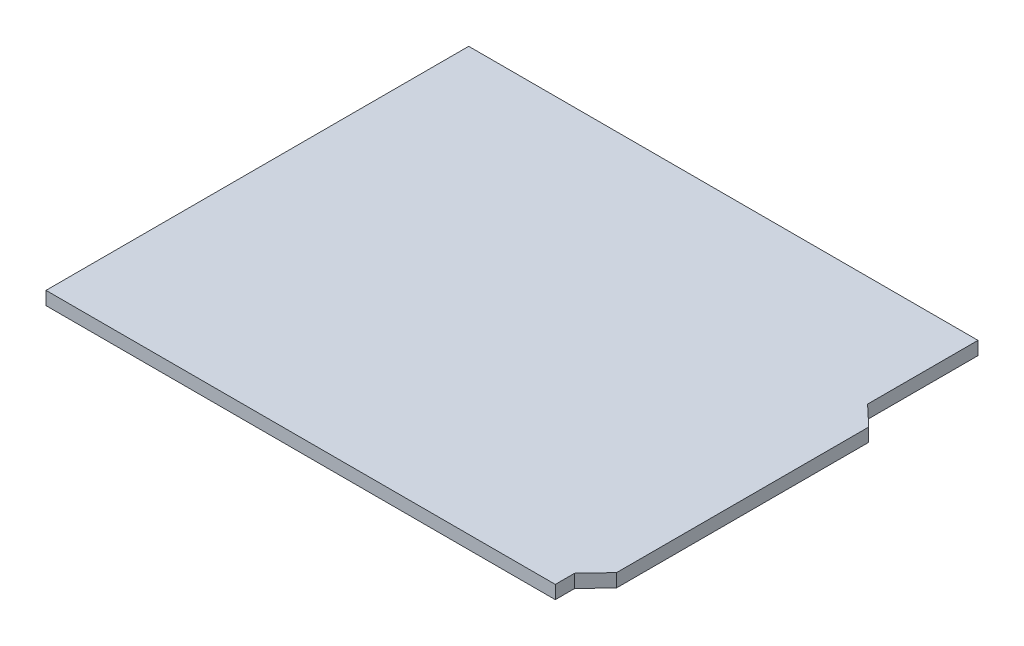
ISO-10303-21;
HEADER;
FILE_DESCRIPTION(('STEP AP214'),'2;1');
FILE_NAME('part.step','',(''),(''),'','','');
FILE_SCHEMA(('AUTOMOTIVE_DESIGN { 1 0 10303 214 1 1 1 1 }'));
ENDSEC;
DATA;
#1=APPLICATION_CONTEXT('core data for automotive mechanical design processes');
#2=APPLICATION_PROTOCOL_DEFINITION('international standard','automotive_design',2000,#1);
#3=PRODUCT_CONTEXT('',#1,'mechanical');
#4=PRODUCT('Part','Part','',(#3));
#5=PRODUCT_RELATED_PRODUCT_CATEGORY('part','',(#4));
#6=PRODUCT_DEFINITION_FORMATION('','',#4);
#7=PRODUCT_DEFINITION_CONTEXT('part definition',#1,'design');
#8=PRODUCT_DEFINITION('design','',#6,#7);
#9=PRODUCT_DEFINITION_SHAPE('','',#8);
#10=(LENGTH_UNIT() NAMED_UNIT(*) SI_UNIT(.MILLI.,.METRE.));
#11=(NAMED_UNIT(*) PLANE_ANGLE_UNIT() SI_UNIT($,.RADIAN.));
#12=(NAMED_UNIT(*) SI_UNIT($,.STERADIAN.) SOLID_ANGLE_UNIT());
#13=UNCERTAINTY_MEASURE_WITH_UNIT(LENGTH_MEASURE(1.E-05),#10,'distance_accuracy_value','');
#14=(GEOMETRIC_REPRESENTATION_CONTEXT(3) GLOBAL_UNCERTAINTY_ASSIGNED_CONTEXT((#13)) GLOBAL_UNIT_ASSIGNED_CONTEXT((#10,
#11,#12)) REPRESENTATION_CONTEXT('',''));
#15=CARTESIAN_POINT('',(0.,0.,0.));
#16=DIRECTION('',(0.,0.,1.));
#17=DIRECTION('',(1.,0.,0.));
#18=AXIS2_PLACEMENT_3D('',#15,#16,#17);
#19=CARTESIAN_POINT('',(0.,1.72,27.41));
#20=DIRECTION('',(0.,0.,-1.));
#21=DIRECTION('',(-1.,0.,0.));
#22=AXIS2_PLACEMENT_3D('',#19,#20,#21);
#23=PLANE('',#22);
#24=DIRECTION('',(1.,0.,0.));
#25=VECTOR('',#24,1.);
#26=CARTESIAN_POINT('',(0.,0.,27.41));
#27=LINE('',#26,#25);
#28=CARTESIAN_POINT('',(-33.025,0.,27.41));
#29=VERTEX_POINT('',#28);
#30=CARTESIAN_POINT('',(33.025,0.,27.41));
#31=VERTEX_POINT('',#30);
#32=EDGE_CURVE('E135',#29,#31,#27,.T.);
#33=ORIENTED_EDGE('',*,*,#32,.T.);
#34=DIRECTION('',(0.,-1.,0.));
#35=VECTOR('',#34,1.);
#36=CARTESIAN_POINT('',(33.025,1.72,27.41));
#37=LINE('',#36,#35);
#38=CARTESIAN_POINT('',(33.025,1.72,27.41));
#39=VERTEX_POINT('',#38);
#40=EDGE_CURVE('E11',#39,#31,#37,.T.);
#41=ORIENTED_EDGE('',*,*,#40,.F.);
#42=DIRECTION('',(1.,0.,0.));
#43=VECTOR('',#42,1.);
#44=CARTESIAN_POINT('',(0.,1.72,27.41));
#45=LINE('',#44,#43);
#46=CARTESIAN_POINT('',(-33.025,1.72,27.41));
#47=VERTEX_POINT('',#46);
#48=EDGE_CURVE('E154',#47,#39,#45,.T.);
#49=ORIENTED_EDGE('',*,*,#48,.F.);
#50=DIRECTION('',(0.,-1.,0.));
#51=VECTOR('',#50,1.);
#52=CARTESIAN_POINT('',(-33.025,1.72,27.41));
#53=LINE('',#52,#51);
#54=EDGE_CURVE('E53',#47,#29,#53,.T.);
#55=ORIENTED_EDGE('',*,*,#54,.T.);
#56=EDGE_LOOP('',(#33,#41,#49,#55));
#57=FACE_BOUND('',#56,.T.);
#58=ADVANCED_FACE('F37',(#57),#23,.F.);
#59=CARTESIAN_POINT('',(33.025,1.72,0.));
#60=DIRECTION('',(-1.,0.,0.));
#61=DIRECTION('',(0.,0.,1.));
#62=AXIS2_PLACEMENT_3D('',#59,#60,#61);
#63=PLANE('',#62);
#64=DIRECTION('',(0.,0.,-1.));
#65=VECTOR('',#64,1.);
#66=CARTESIAN_POINT('',(33.025,0.,0.));
#67=LINE('',#66,#65);
#68=CARTESIAN_POINT('',(33.025,0.,24.91));
#69=VERTEX_POINT('',#68);
#70=EDGE_CURVE('E137',#31,#69,#67,.T.);
#71=ORIENTED_EDGE('',*,*,#70,.T.);
#72=DIRECTION('',(0.,-1.,0.));
#73=VECTOR('',#72,1.);
#74=CARTESIAN_POINT('',(33.025,1.72,24.91));
#75=LINE('',#74,#73);
#76=CARTESIAN_POINT('',(33.025,1.72,24.91));
#77=VERTEX_POINT('',#76);
#78=EDGE_CURVE('E45',#77,#69,#75,.T.);
#79=ORIENTED_EDGE('',*,*,#78,.F.);
#80=DIRECTION('',(0.,0.,-1.));
#81=VECTOR('',#80,1.);
#82=CARTESIAN_POINT('',(33.025,1.72,0.));
#83=LINE('',#82,#81);
#84=EDGE_CURVE('E91',#39,#77,#83,.T.);
#85=ORIENTED_EDGE('',*,*,#84,.F.);
#86=ORIENTED_EDGE('',*,*,#40,.T.);
#87=EDGE_LOOP('',(#71,#79,#85,#86));
#88=FACE_BOUND('',#87,.T.);
#89=ADVANCED_FACE('F167',(#88),#63,.F.);
#90=CARTESIAN_POINT('',(29.8569015979815,1.72,28.2574247266611));
#91=DIRECTION('',(0.726293399809768,0.,0.687384824819961));
#92=DIRECTION('',(0.687384824819961,0.,-0.726293399809768));
#93=AXIS2_PLACEMENT_3D('',#90,#91,#92);
#94=PLANE('',#93);
#95=DIRECTION('',(-0.687384824819961,0.,0.726293399809768));
#96=VECTOR('',#95,1.);
#97=CARTESIAN_POINT('',(29.8569015979815,0.,28.2574247266611));
#98=LINE('',#97,#96);
#99=CARTESIAN_POINT('',(35.675,0.,22.11));
#100=VERTEX_POINT('',#99);
#101=EDGE_CURVE('E140',#100,#69,#98,.T.);
#102=ORIENTED_EDGE('',*,*,#101,.F.);
#103=DIRECTION('',(0.,-1.,0.));
#104=VECTOR('',#103,1.);
#105=CARTESIAN_POINT('',(35.675,1.72,22.11));
#106=LINE('',#105,#104);
#107=CARTESIAN_POINT('',(35.675,1.72,22.11));
#108=VERTEX_POINT('',#107);
#109=EDGE_CURVE('E160',#108,#100,#106,.T.);
#110=ORIENTED_EDGE('',*,*,#109,.F.);
#111=DIRECTION('',(-0.687384824819961,0.,0.726293399809768));
#112=VECTOR('',#111,1.);
#113=CARTESIAN_POINT('',(29.8569015979815,1.72,28.2574247266611));
#114=LINE('',#113,#112);
#115=EDGE_CURVE('E166',#108,#77,#114,.T.);
#116=ORIENTED_EDGE('',*,*,#115,.T.);
#117=ORIENTED_EDGE('',*,*,#78,.T.);
#118=EDGE_LOOP('',(#102,#110,#116,#117));
#119=FACE_BOUND('',#118,.T.);
#120=ADVANCED_FACE('F164',(#119),#94,.T.);
#121=CARTESIAN_POINT('',(35.675,1.72,0.));
#122=DIRECTION('',(1.,0.,0.));
#123=DIRECTION('',(0.,0.,-1.));
#124=AXIS2_PLACEMENT_3D('',#121,#122,#123);
#125=PLANE('',#124);
#126=DIRECTION('',(0.,0.,1.));
#127=VECTOR('',#126,1.);
#128=CARTESIAN_POINT('',(35.675,0.,0.));
#129=LINE('',#128,#127);
#130=CARTESIAN_POINT('',(35.675,0.,-10.59));
#131=VERTEX_POINT('',#130);
#132=EDGE_CURVE('E143',#131,#100,#129,.T.);
#133=ORIENTED_EDGE('',*,*,#132,.F.);
#134=DIRECTION('',(0.,-1.,0.));
#135=VECTOR('',#134,1.);
#136=CARTESIAN_POINT('',(35.675,1.72,-10.59));
#137=LINE('',#136,#135);
#138=CARTESIAN_POINT('',(35.675,1.72,-10.59));
#139=VERTEX_POINT('',#138);
#140=EDGE_CURVE('E158',#139,#131,#137,.T.);
#141=ORIENTED_EDGE('',*,*,#140,.F.);
#142=DIRECTION('',(0.,0.,1.));
#143=VECTOR('',#142,1.);
#144=CARTESIAN_POINT('',(35.675,1.72,0.));
#145=LINE('',#144,#143);
#146=EDGE_CURVE('E176',#139,#108,#145,.T.);
#147=ORIENTED_EDGE('',*,*,#146,.T.);
#148=ORIENTED_EDGE('',*,*,#109,.T.);
#149=EDGE_LOOP('',(#133,#141,#147,#148));
#150=FACE_BOUND('',#149,.T.);
#151=ADVANCED_FACE('F174',(#150),#125,.T.);
#152=CARTESIAN_POINT('',(22.0853268035411,1.72,-23.4104464117536));
#153=DIRECTION('',(0.686220426895719,0.,-0.727393652509463));
#154=DIRECTION('',(-0.727393652509463,0.,-0.686220426895719));
#155=AXIS2_PLACEMENT_3D('',#152,#153,#154);
#156=PLANE('',#155);
#157=DIRECTION('',(0.727393652509463,0.,0.686220426895719));
#158=VECTOR('',#157,1.);
#159=CARTESIAN_POINT('',(22.0853268035411,0.,-23.4104464117536));
#160=LINE('',#159,#158);
#161=CARTESIAN_POINT('',(33.025,0.,-13.09));
#162=VERTEX_POINT('',#161);
#163=EDGE_CURVE('E146',#162,#131,#160,.T.);
#164=ORIENTED_EDGE('',*,*,#163,.F.);
#165=DIRECTION('',(0.,-1.,0.));
#166=VECTOR('',#165,1.);
#167=CARTESIAN_POINT('',(33.025,1.72,-13.09));
#168=LINE('',#167,#166);
#169=CARTESIAN_POINT('',(33.025,1.72,-13.09));
#170=VERTEX_POINT('',#169);
#171=EDGE_CURVE('E126',#170,#162,#168,.T.);
#172=ORIENTED_EDGE('',*,*,#171,.F.);
#173=DIRECTION('',(0.727393652509463,0.,0.686220426895719));
#174=VECTOR('',#173,1.);
#175=CARTESIAN_POINT('',(22.0853268035411,1.72,-23.4104464117536));
#176=LINE('',#175,#174);
#177=EDGE_CURVE('E116',#170,#139,#176,.T.);
#178=ORIENTED_EDGE('',*,*,#177,.T.);
#179=ORIENTED_EDGE('',*,*,#140,.T.);
#180=EDGE_LOOP('',(#164,#172,#178,#179));
#181=FACE_BOUND('',#180,.T.);
#182=ADVANCED_FACE('F199',(#181),#156,.T.);
#183=CARTESIAN_POINT('',(33.025,0.,-27.41));
#184=VERTEX_POINT('',#183);
#185=EDGE_CURVE('E123',#162,#184,#67,.T.);
#186=ORIENTED_EDGE('',*,*,#185,.T.);
#187=DIRECTION('',(0.,-1.,0.));
#188=VECTOR('',#187,1.);
#189=CARTESIAN_POINT('',(33.025,1.72,-27.41));
#190=LINE('',#189,#188);
#191=CARTESIAN_POINT('',(33.025,1.72,-27.41));
#192=VERTEX_POINT('',#191);
#193=EDGE_CURVE('E120',#192,#184,#190,.T.);
#194=ORIENTED_EDGE('',*,*,#193,.F.);
#195=EDGE_CURVE('E108',#170,#192,#83,.T.);
#196=ORIENTED_EDGE('',*,*,#195,.F.);
#197=ORIENTED_EDGE('',*,*,#171,.T.);
#198=EDGE_LOOP('',(#186,#194,#196,#197));
#199=FACE_BOUND('',#198,.T.);
#200=ADVANCED_FACE('F121',(#199),#63,.F.);
#201=CARTESIAN_POINT('',(0.,1.72,-27.41));
#202=DIRECTION('',(0.,0.,-1.));
#203=DIRECTION('',(-1.,0.,0.));
#204=AXIS2_PLACEMENT_3D('',#201,#202,#203);
#205=PLANE('',#204);
#206=DIRECTION('',(1.,0.,0.));
#207=VECTOR('',#206,1.);
#208=CARTESIAN_POINT('',(0.,0.,-27.41));
#209=LINE('',#208,#207);
#210=CARTESIAN_POINT('',(-33.025,0.,-27.41));
#211=VERTEX_POINT('',#210);
#212=EDGE_CURVE('E149',#211,#184,#209,.T.);
#213=ORIENTED_EDGE('',*,*,#212,.F.);
#214=DIRECTION('',(0.,-1.,0.));
#215=VECTOR('',#214,1.);
#216=CARTESIAN_POINT('',(-33.025,1.72,-27.41));
#217=LINE('',#216,#215);
#218=CARTESIAN_POINT('',(-33.025,1.72,-27.41));
#219=VERTEX_POINT('',#218);
#220=EDGE_CURVE('E79',#219,#211,#217,.T.);
#221=ORIENTED_EDGE('',*,*,#220,.F.);
#222=DIRECTION('',(1.,0.,0.));
#223=VECTOR('',#222,1.);
#224=CARTESIAN_POINT('',(0.,1.72,-27.41));
#225=LINE('',#224,#223);
#226=EDGE_CURVE('E113',#219,#192,#225,.T.);
#227=ORIENTED_EDGE('',*,*,#226,.T.);
#228=ORIENTED_EDGE('',*,*,#193,.T.);
#229=EDGE_LOOP('',(#213,#221,#227,#228));
#230=FACE_BOUND('',#229,.T.);
#231=ADVANCED_FACE('F128',(#230),#205,.T.);
#232=CARTESIAN_POINT('',(-33.025,1.72,0.));
#233=DIRECTION('',(-1.,0.,0.));
#234=DIRECTION('',(0.,0.,1.));
#235=AXIS2_PLACEMENT_3D('',#232,#233,#234);
#236=PLANE('',#235);
#237=DIRECTION('',(0.,0.,-1.));
#238=VECTOR('',#237,1.);
#239=CARTESIAN_POINT('',(-33.025,0.,0.));
#240=LINE('',#239,#238);
#241=EDGE_CURVE('E151',#29,#211,#240,.T.);
#242=ORIENTED_EDGE('',*,*,#241,.F.);
#243=ORIENTED_EDGE('',*,*,#54,.F.);
#244=DIRECTION('',(0.,0.,-1.));
#245=VECTOR('',#244,1.);
#246=CARTESIAN_POINT('',(-33.025,1.72,0.));
#247=LINE('',#246,#245);
#248=EDGE_CURVE('E129',#47,#219,#247,.T.);
#249=ORIENTED_EDGE('',*,*,#248,.T.);
#250=ORIENTED_EDGE('',*,*,#220,.T.);
#251=EDGE_LOOP('',(#242,#243,#249,#250));
#252=FACE_BOUND('',#251,.T.);
#253=ADVANCED_FACE('F179',(#252),#236,.T.);
#254=CARTESIAN_POINT('',(0.,1.72,0.));
#255=DIRECTION('',(0.,1.,0.));
#256=DIRECTION('',(0.,0.,1.));
#257=AXIS2_PLACEMENT_3D('',#254,#255,#256);
#258=PLANE('',#257);
#259=ORIENTED_EDGE('',*,*,#48,.T.);
#260=ORIENTED_EDGE('',*,*,#84,.T.);
#261=ORIENTED_EDGE('',*,*,#115,.F.);
#262=ORIENTED_EDGE('',*,*,#146,.F.);
#263=ORIENTED_EDGE('',*,*,#177,.F.);
#264=ORIENTED_EDGE('',*,*,#195,.T.);
#265=ORIENTED_EDGE('',*,*,#226,.F.);
#266=ORIENTED_EDGE('',*,*,#248,.F.);
#267=EDGE_LOOP('',(#259,#260,#261,#262,#263,#264,#265,#266));
#268=FACE_BOUND('',#267,.T.);
#269=ADVANCED_FACE('F110',(#268),#258,.T.);
#270=CARTESIAN_POINT('',(0.,0.,0.));
#271=DIRECTION('',(0.,1.,0.));
#272=DIRECTION('',(0.,0.,1.));
#273=AXIS2_PLACEMENT_3D('',#270,#271,#272);
#274=PLANE('',#273);
#275=ORIENTED_EDGE('',*,*,#32,.F.);
#276=ORIENTED_EDGE('',*,*,#241,.T.);
#277=ORIENTED_EDGE('',*,*,#212,.T.);
#278=ORIENTED_EDGE('',*,*,#185,.F.);
#279=ORIENTED_EDGE('',*,*,#163,.T.);
#280=ORIENTED_EDGE('',*,*,#132,.T.);
#281=ORIENTED_EDGE('',*,*,#101,.T.);
#282=ORIENTED_EDGE('',*,*,#70,.F.);
#283=EDGE_LOOP('',(#275,#276,#277,#278,#279,#280,#281,#282));
#284=FACE_BOUND('',#283,.T.);
#285=ADVANCED_FACE('F170',(#284),#274,.F.);
#286=CLOSED_SHELL('',(#58,#89,#120,#151,#182,#200,#231,#253,#269,#285));
#287=MANIFOLD_SOLID_BREP('B2',#286);
#288=ADVANCED_BREP_SHAPE_REPRESENTATION('',(#18,#287),#14);
#289=SHAPE_DEFINITION_REPRESENTATION(#9,#288);
ENDSEC;
END-ISO-10303-21;
